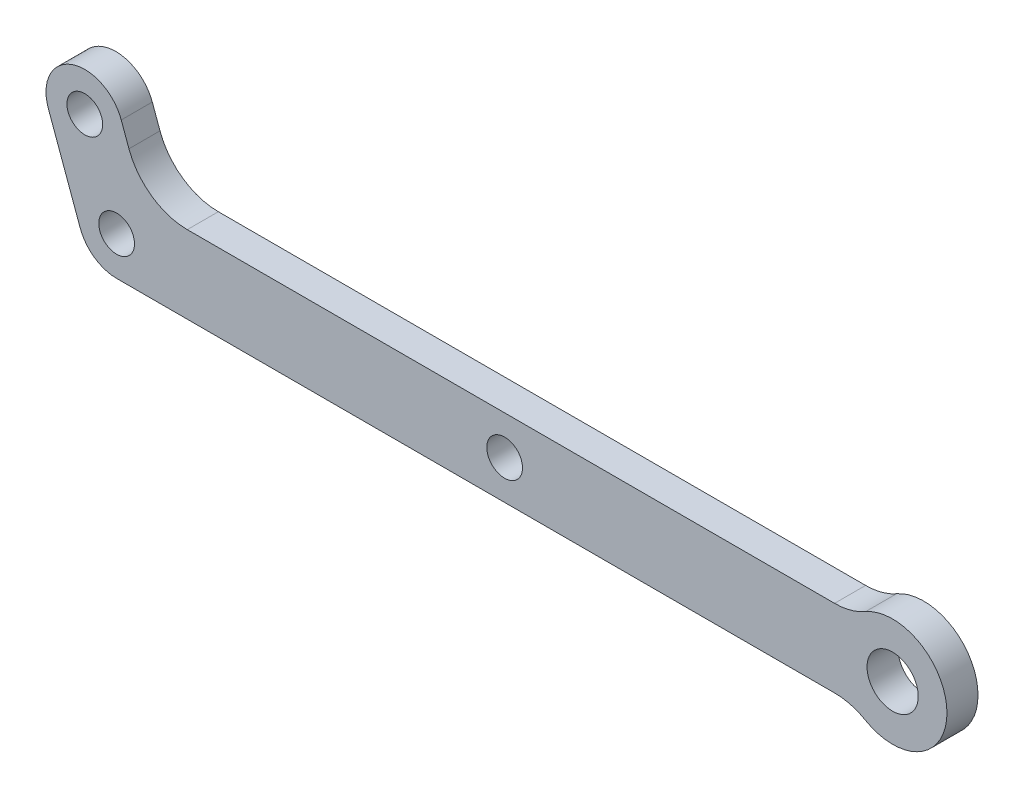
ISO-10303-21;
HEADER;
FILE_DESCRIPTION(('STEP AP214'),'2;1');
FILE_NAME('part.step','',(''),(''),'','','');
FILE_SCHEMA(('AUTOMOTIVE_DESIGN { 1 0 10303 214 1 1 1 1 }'));
ENDSEC;
DATA;
#1=APPLICATION_CONTEXT('core data for automotive mechanical design processes');
#2=APPLICATION_PROTOCOL_DEFINITION('international standard','automotive_design',2000,#1);
#3=PRODUCT_CONTEXT('',#1,'mechanical');
#4=PRODUCT('Part','Part','',(#3));
#5=PRODUCT_RELATED_PRODUCT_CATEGORY('part','',(#4));
#6=PRODUCT_DEFINITION_FORMATION('','',#4);
#7=PRODUCT_DEFINITION_CONTEXT('part definition',#1,'design');
#8=PRODUCT_DEFINITION('design','',#6,#7);
#9=PRODUCT_DEFINITION_SHAPE('','',#8);
#10=(LENGTH_UNIT() NAMED_UNIT(*) SI_UNIT(.MILLI.,.METRE.));
#11=(NAMED_UNIT(*) PLANE_ANGLE_UNIT() SI_UNIT($,.RADIAN.));
#12=(NAMED_UNIT(*) SI_UNIT($,.STERADIAN.) SOLID_ANGLE_UNIT());
#13=UNCERTAINTY_MEASURE_WITH_UNIT(LENGTH_MEASURE(1.E-05),#10,'distance_accuracy_value','');
#14=(GEOMETRIC_REPRESENTATION_CONTEXT(3) GLOBAL_UNCERTAINTY_ASSIGNED_CONTEXT((#13)) GLOBAL_UNIT_ASSIGNED_CONTEXT((#10,
#11,#12)) REPRESENTATION_CONTEXT('',''));
#15=CARTESIAN_POINT('',(0.,0.,0.));
#16=DIRECTION('',(0.,0.,1.));
#17=DIRECTION('',(1.,0.,0.));
#18=AXIS2_PLACEMENT_3D('',#15,#16,#17);
#19=CARTESIAN_POINT('',(-45.4486510016369,6.5,2.));
#20=DIRECTION('',(0.,0.,1.));
#21=DIRECTION('',(1.,0.,0.));
#22=AXIS2_PLACEMENT_3D('',#19,#20,#21);
#23=CYLINDRICAL_SURFACE('',#22,4.);
#24=CARTESIAN_POINT('',(-45.4486510016369,6.5,2.));
#25=DIRECTION('',(0.,0.,-1.));
#26=DIRECTION('',(1.,0.,0.));
#27=AXIS2_PLACEMENT_3D('',#24,#25,#26);
#28=CIRCLE('',#27,4.);
#29=CARTESIAN_POINT('',(-45.4486510016369,2.5,2.));
#30=VERTEX_POINT('',#29);
#31=CARTESIAN_POINT('',(-49.2074214847805,5.13191942669733,2.));
#32=VERTEX_POINT('',#31);
#33=EDGE_CURVE('E187',#30,#32,#28,.T.);
#34=ORIENTED_EDGE('',*,*,#33,.F.);
#35=DIRECTION('',(0.,0.,1.));
#36=VECTOR('',#35,1.);
#37=CARTESIAN_POINT('',(-45.4486510016369,2.5,2.));
#38=LINE('',#37,#36);
#39=CARTESIAN_POINT('',(-45.4486510016369,2.5,0.));
#40=VERTEX_POINT('',#39);
#41=EDGE_CURVE('E195',#40,#30,#38,.T.);
#42=ORIENTED_EDGE('',*,*,#41,.F.);
#43=CARTESIAN_POINT('',(-45.4486510016369,6.5,0.));
#44=DIRECTION('',(0.,0.,1.));
#45=DIRECTION('',(1.,0.,0.));
#46=AXIS2_PLACEMENT_3D('',#43,#44,#45);
#47=CIRCLE('',#46,4.);
#48=CARTESIAN_POINT('',(-49.2074214847805,5.13191942669733,0.));
#49=VERTEX_POINT('',#48);
#50=EDGE_CURVE('E27',#49,#40,#47,.T.);
#51=ORIENTED_EDGE('',*,*,#50,.F.);
#52=DIRECTION('',(0.,0.,-1.));
#53=VECTOR('',#52,1.);
#54=CARTESIAN_POINT('',(-49.2074214847805,5.13191942669733,0.));
#55=LINE('',#54,#53);
#56=EDGE_CURVE('E193',#32,#49,#55,.T.);
#57=ORIENTED_EDGE('',*,*,#56,.F.);
#58=EDGE_LOOP('',(#34,#42,#51,#57));
#59=FACE_BOUND('',#58,.T.);
#60=ADVANCED_FACE('F17',(#59),#23,.F.);
#61=CARTESIAN_POINT('',(-3.74165738677394,6.5,2.));
#62=DIRECTION('',(0.,0.,-1.));
#63=DIRECTION('',(-1.,0.,0.));
#64=AXIS2_PLACEMENT_3D('',#61,#62,#63);
#65=CYLINDRICAL_SURFACE('',#64,4.);
#66=CARTESIAN_POINT('',(-3.74165738677394,6.5,2.));
#67=DIRECTION('',(0.,0.,-1.));
#68=DIRECTION('',(1.,0.,0.));
#69=AXIS2_PLACEMENT_3D('',#66,#67,#68);
#70=CIRCLE('',#69,4.);
#71=CARTESIAN_POINT('',(-1.7461067804945,3.03333333333333,2.));
#72=VERTEX_POINT('',#71);
#73=CARTESIAN_POINT('',(-3.74165738677394,2.5,2.));
#74=VERTEX_POINT('',#73);
#75=EDGE_CURVE('E218',#72,#74,#70,.T.);
#76=ORIENTED_EDGE('',*,*,#75,.F.);
#77=DIRECTION('',(0.,0.,1.));
#78=VECTOR('',#77,1.);
#79=CARTESIAN_POINT('',(-1.7461067804945,3.03333333333333,2.));
#80=LINE('',#79,#78);
#81=CARTESIAN_POINT('',(-1.7461067804945,3.03333333333333,0.));
#82=VERTEX_POINT('',#81);
#83=EDGE_CURVE('E172',#82,#72,#80,.T.);
#84=ORIENTED_EDGE('',*,*,#83,.F.);
#85=CARTESIAN_POINT('',(-3.74165738677394,6.5,0.));
#86=DIRECTION('',(0.,0.,1.));
#87=DIRECTION('',(1.,0.,0.));
#88=AXIS2_PLACEMENT_3D('',#85,#86,#87);
#89=CIRCLE('',#88,4.);
#90=CARTESIAN_POINT('',(-3.74165738677394,2.5,0.));
#91=VERTEX_POINT('',#90);
#92=EDGE_CURVE('E11',#91,#82,#89,.T.);
#93=ORIENTED_EDGE('',*,*,#92,.F.);
#94=DIRECTION('',(0.,0.,-1.));
#95=VECTOR('',#94,1.);
#96=CARTESIAN_POINT('',(-3.74165738677394,2.5,0.));
#97=LINE('',#96,#95);
#98=EDGE_CURVE('E178',#74,#91,#97,.T.);
#99=ORIENTED_EDGE('',*,*,#98,.F.);
#100=EDGE_LOOP('',(#76,#84,#93,#99));
#101=FACE_BOUND('',#100,.T.);
#102=ADVANCED_FACE('F248',(#101),#65,.F.);
#103=CARTESIAN_POINT('',(-3.74165738677394,-6.5,2.));
#104=DIRECTION('',(0.,0.,-1.));
#105=DIRECTION('',(-1.,0.,0.));
#106=AXIS2_PLACEMENT_3D('',#103,#104,#105);
#107=CYLINDRICAL_SURFACE('',#106,4.);
#108=CARTESIAN_POINT('',(-3.74165738677394,-6.5,2.));
#109=DIRECTION('',(0.,0.,-1.));
#110=DIRECTION('',(1.,0.,0.));
#111=AXIS2_PLACEMENT_3D('',#108,#109,#110);
#112=CIRCLE('',#111,4.);
#113=CARTESIAN_POINT('',(-3.74165738677394,-2.5,2.));
#114=VERTEX_POINT('',#113);
#115=CARTESIAN_POINT('',(-1.7461067804945,-3.03333333333333,2.));
#116=VERTEX_POINT('',#115);
#117=EDGE_CURVE('E36',#114,#116,#112,.T.);
#118=ORIENTED_EDGE('',*,*,#117,.F.);
#119=DIRECTION('',(0.,0.,1.));
#120=VECTOR('',#119,1.);
#121=CARTESIAN_POINT('',(-3.74165738677394,-2.5,2.));
#122=LINE('',#121,#120);
#123=CARTESIAN_POINT('',(-3.74165738677394,-2.5,0.));
#124=VERTEX_POINT('',#123);
#125=EDGE_CURVE('E217',#124,#114,#122,.T.);
#126=ORIENTED_EDGE('',*,*,#125,.F.);
#127=CARTESIAN_POINT('',(-3.74165738677394,-6.5,0.));
#128=DIRECTION('',(0.,0.,1.));
#129=DIRECTION('',(1.,0.,0.));
#130=AXIS2_PLACEMENT_3D('',#127,#128,#129);
#131=CIRCLE('',#130,4.);
#132=CARTESIAN_POINT('',(-1.7461067804945,-3.03333333333333,0.));
#133=VERTEX_POINT('',#132);
#134=EDGE_CURVE('E184',#133,#124,#131,.T.);
#135=ORIENTED_EDGE('',*,*,#134,.F.);
#136=DIRECTION('',(0.,0.,-1.));
#137=VECTOR('',#136,1.);
#138=CARTESIAN_POINT('',(-1.7461067804945,-3.03333333333333,2.));
#139=LINE('',#138,#137);
#140=EDGE_CURVE('E161',#116,#133,#139,.T.);
#141=ORIENTED_EDGE('',*,*,#140,.F.);
#142=EDGE_LOOP('',(#118,#126,#135,#141));
#143=FACE_BOUND('',#142,.T.);
#144=ADVANCED_FACE('F254',(#143),#107,.F.);
#145=CARTESIAN_POINT('',(0.,0.,0.));
#146=DIRECTION('',(0.,0.,1.));
#147=DIRECTION('',(1.,0.,0.));
#148=AXIS2_PLACEMENT_3D('',#145,#146,#147);
#149=PLANE('',#148);
#150=CARTESIAN_POINT('',(-52.052120859954,5.63815572471545,0.));
#151=DIRECTION('',(0.,0.,1.));
#152=DIRECTION('',(1.,0.,0.));
#153=AXIS2_PLACEMENT_3D('',#150,#151,#152);
#154=CIRCLE('',#153,1.15);
#155=CARTESIAN_POINT('',(-50.902120859954,5.63815572471545,0.));
#156=VERTEX_POINT('',#155);
#157=EDGE_CURVE('E273',#156,#156,#154,.T.);
#158=ORIENTED_EDGE('',*,*,#157,.T.);
#159=EDGE_LOOP('',(#158));
#160=FACE_BOUND('',#159,.T.);
#161=CARTESIAN_POINT('',(0.,0.,0.));
#162=DIRECTION('',(0.,0.,1.));
#163=DIRECTION('',(1.,0.,0.));
#164=AXIS2_PLACEMENT_3D('',#161,#162,#163);
#165=CIRCLE('',#164,1.64999999999993);
#166=CARTESIAN_POINT('',(1.64999999999993,0.,0.));
#167=VERTEX_POINT('',#166);
#168=EDGE_CURVE('E144',#167,#167,#165,.T.);
#169=ORIENTED_EDGE('',*,*,#168,.T.);
#170=EDGE_LOOP('',(#169));
#171=FACE_BOUND('',#170,.T.);
#172=CARTESIAN_POINT('',(-50.,0.,0.));
#173=DIRECTION('',(0.,0.,1.));
#174=DIRECTION('',(1.,0.,0.));
#175=AXIS2_PLACEMENT_3D('',#172,#173,#174);
#176=CIRCLE('',#175,1.15);
#177=CARTESIAN_POINT('',(-48.85,0.,0.));
#178=VERTEX_POINT('',#177);
#179=EDGE_CURVE('E287',#178,#178,#176,.T.);
#180=ORIENTED_EDGE('',*,*,#179,.T.);
#181=EDGE_LOOP('',(#180));
#182=FACE_BOUND('',#181,.T.);
#183=CARTESIAN_POINT('',(-25.,0.,0.));
#184=DIRECTION('',(0.,0.,1.));
#185=DIRECTION('',(1.,0.,0.));
#186=AXIS2_PLACEMENT_3D('',#183,#184,#185);
#187=CIRCLE('',#186,1.15);
#188=CARTESIAN_POINT('',(-23.85,0.,0.));
#189=VERTEX_POINT('',#188);
#190=EDGE_CURVE('E271',#189,#189,#187,.T.);
#191=ORIENTED_EDGE('',*,*,#190,.T.);
#192=EDGE_LOOP('',(#191));
#193=FACE_BOUND('',#192,.T.);
#194=CARTESIAN_POINT('',(0.,0.,0.));
#195=DIRECTION('',(0.,0.,1.));
#196=DIRECTION('',(1.,0.,0.));
#197=AXIS2_PLACEMENT_3D('',#194,#195,#196);
#198=CIRCLE('',#197,3.5);
#199=EDGE_CURVE('E164',#133,#82,#198,.T.);
#200=ORIENTED_EDGE('',*,*,#199,.F.);
#201=ORIENTED_EDGE('',*,*,#134,.T.);
#202=DIRECTION('',(-1.,0.,0.));
#203=VECTOR('',#202,1.);
#204=CARTESIAN_POINT('',(0.,-2.5,0.));
#205=LINE('',#204,#203);
#206=CARTESIAN_POINT('',(-50.,-2.5,0.));
#207=VERTEX_POINT('',#206);
#208=EDGE_CURVE('E214',#124,#207,#205,.T.);
#209=ORIENTED_EDGE('',*,*,#208,.T.);
#210=CARTESIAN_POINT('',(-50.,0.,0.));
#211=DIRECTION('',(0.,0.,1.));
#212=DIRECTION('',(1.,0.,0.));
#213=AXIS2_PLACEMENT_3D('',#210,#211,#212);
#214=CIRCLE('',#213,2.5);
#215=CARTESIAN_POINT('',(-52.3492315519648,-0.855050358314174,0.));
#216=VERTEX_POINT('',#215);
#217=EDGE_CURVE('E127',#216,#207,#214,.T.);
#218=ORIENTED_EDGE('',*,*,#217,.F.);
#219=DIRECTION('',(-0.342020143325668,0.939692620785909,0.));
#220=VECTOR('',#219,1.);
#221=CARTESIAN_POINT('',(-46.5003426299392,-16.9247406004776,0.));
#222=LINE('',#221,#220);
#223=CARTESIAN_POINT('',(-54.4013524119188,4.78310536640128,0.));
#224=VERTEX_POINT('',#223);
#225=EDGE_CURVE('E169',#216,#224,#222,.T.);
#226=ORIENTED_EDGE('',*,*,#225,.T.);
#227=CARTESIAN_POINT('',(-52.052120859954,5.63815572471545,0.));
#228=DIRECTION('',(0.,0.,1.));
#229=DIRECTION('',(1.,0.,0.));
#230=AXIS2_PLACEMENT_3D('',#227,#228,#229);
#231=CIRCLE('',#230,2.5);
#232=CARTESIAN_POINT('',(-49.7028893079892,6.49320608302961,0.));
#233=VERTEX_POINT('',#232);
#234=EDGE_CURVE('E137',#233,#224,#231,.T.);
#235=ORIENTED_EDGE('',*,*,#234,.F.);
#236=DIRECTION('',(-0.342020143325666,0.93969262078591,0.));
#237=VECTOR('',#236,1.);
#238=CARTESIAN_POINT('',(-41.8018795260098,-15.2146398838492,0.));
#239=LINE('',#238,#237);
#240=EDGE_CURVE('E200',#49,#233,#239,.T.);
#241=ORIENTED_EDGE('',*,*,#240,.F.);
#242=ORIENTED_EDGE('',*,*,#50,.T.);
#243=DIRECTION('',(-1.,0.,0.));
#244=VECTOR('',#243,1.);
#245=CARTESIAN_POINT('',(0.,2.5,0.));
#246=LINE('',#245,#244);
#247=EDGE_CURVE('E182',#91,#40,#246,.T.);
#248=ORIENTED_EDGE('',*,*,#247,.F.);
#249=ORIENTED_EDGE('',*,*,#92,.T.);
#250=EDGE_LOOP('',(#200,#201,#209,#218,#226,#235,#241,#242,#248,#249));
#251=FACE_BOUND('',#250,.T.);
#252=ADVANCED_FACE('F238',(#160,#171,#182,#193,#251),#149,.F.);
#253=CARTESIAN_POINT('',(0.,0.,2.));
#254=DIRECTION('',(0.,0.,1.));
#255=DIRECTION('',(1.,0.,0.));
#256=AXIS2_PLACEMENT_3D('',#253,#254,#255);
#257=PLANE('',#256);
#258=CARTESIAN_POINT('',(-52.052120859954,5.63815572471545,2.));
#259=DIRECTION('',(0.,0.,1.));
#260=DIRECTION('',(1.,0.,0.));
#261=AXIS2_PLACEMENT_3D('',#258,#259,#260);
#262=CIRCLE('',#261,1.15);
#263=CARTESIAN_POINT('',(-50.902120859954,5.63815572471545,2.));
#264=VERTEX_POINT('',#263);
#265=EDGE_CURVE('E276',#264,#264,#262,.T.);
#266=ORIENTED_EDGE('',*,*,#265,.F.);
#267=EDGE_LOOP('',(#266));
#268=FACE_BOUND('',#267,.T.);
#269=CARTESIAN_POINT('',(0.,0.,2.));
#270=DIRECTION('',(0.,0.,1.));
#271=DIRECTION('',(1.,0.,0.));
#272=AXIS2_PLACEMENT_3D('',#269,#270,#271);
#273=CIRCLE('',#272,1.64999999999993);
#274=CARTESIAN_POINT('',(1.64999999999993,0.,2.));
#275=VERTEX_POINT('',#274);
#276=EDGE_CURVE('E153',#275,#275,#273,.T.);
#277=ORIENTED_EDGE('',*,*,#276,.F.);
#278=EDGE_LOOP('',(#277));
#279=FACE_BOUND('',#278,.T.);
#280=CARTESIAN_POINT('',(-50.,0.,2.));
#281=DIRECTION('',(0.,0.,1.));
#282=DIRECTION('',(1.,0.,0.));
#283=AXIS2_PLACEMENT_3D('',#280,#281,#282);
#284=CIRCLE('',#283,1.15);
#285=CARTESIAN_POINT('',(-48.85,0.,2.));
#286=VERTEX_POINT('',#285);
#287=EDGE_CURVE('E284',#286,#286,#284,.T.);
#288=ORIENTED_EDGE('',*,*,#287,.F.);
#289=EDGE_LOOP('',(#288));
#290=FACE_BOUND('',#289,.T.);
#291=CARTESIAN_POINT('',(-25.,0.,2.));
#292=DIRECTION('',(0.,0.,1.));
#293=DIRECTION('',(1.,0.,0.));
#294=AXIS2_PLACEMENT_3D('',#291,#292,#293);
#295=CIRCLE('',#294,1.15);
#296=CARTESIAN_POINT('',(-23.85,0.,2.));
#297=VERTEX_POINT('',#296);
#298=EDGE_CURVE('E279',#297,#297,#295,.T.);
#299=ORIENTED_EDGE('',*,*,#298,.F.);
#300=EDGE_LOOP('',(#299));
#301=FACE_BOUND('',#300,.T.);
#302=DIRECTION('',(-1.,0.,0.));
#303=VECTOR('',#302,1.);
#304=CARTESIAN_POINT('',(0.,-2.5,2.));
#305=LINE('',#304,#303);
#306=CARTESIAN_POINT('',(-50.,-2.5,2.));
#307=VERTEX_POINT('',#306);
#308=EDGE_CURVE('E223',#114,#307,#305,.T.);
#309=ORIENTED_EDGE('',*,*,#308,.F.);
#310=ORIENTED_EDGE('',*,*,#117,.T.);
#311=CARTESIAN_POINT('',(0.,0.,2.));
#312=DIRECTION('',(0.,0.,1.));
#313=DIRECTION('',(1.,0.,0.));
#314=AXIS2_PLACEMENT_3D('',#311,#312,#313);
#315=CIRCLE('',#314,3.5);
#316=EDGE_CURVE('E139',#116,#72,#315,.T.);
#317=ORIENTED_EDGE('',*,*,#316,.T.);
#318=ORIENTED_EDGE('',*,*,#75,.T.);
#319=DIRECTION('',(-1.,0.,0.));
#320=VECTOR('',#319,1.);
#321=CARTESIAN_POINT('',(0.,2.5,2.));
#322=LINE('',#321,#320);
#323=EDGE_CURVE('E177',#74,#30,#322,.T.);
#324=ORIENTED_EDGE('',*,*,#323,.T.);
#325=ORIENTED_EDGE('',*,*,#33,.T.);
#326=DIRECTION('',(-0.342020143325666,0.93969262078591,0.));
#327=VECTOR('',#326,1.);
#328=CARTESIAN_POINT('',(-41.8018795260098,-15.2146398838492,2.));
#329=LINE('',#328,#327);
#330=CARTESIAN_POINT('',(-49.7028893079892,6.49320608302961,2.));
#331=VERTEX_POINT('',#330);
#332=EDGE_CURVE('E141',#32,#331,#329,.T.);
#333=ORIENTED_EDGE('',*,*,#332,.T.);
#334=CARTESIAN_POINT('',(-52.052120859954,5.63815572471545,2.));
#335=DIRECTION('',(0.,0.,1.));
#336=DIRECTION('',(1.,0.,0.));
#337=AXIS2_PLACEMENT_3D('',#334,#335,#336);
#338=CIRCLE('',#337,2.5);
#339=CARTESIAN_POINT('',(-54.4013524119188,4.78310536640128,2.));
#340=VERTEX_POINT('',#339);
#341=EDGE_CURVE('E133',#331,#340,#338,.T.);
#342=ORIENTED_EDGE('',*,*,#341,.T.);
#343=DIRECTION('',(-0.342020143325668,0.939692620785909,0.));
#344=VECTOR('',#343,1.);
#345=CARTESIAN_POINT('',(-46.5003426299392,-16.9247406004776,2.));
#346=LINE('',#345,#344);
#347=CARTESIAN_POINT('',(-52.3492315519648,-0.855050358314174,2.));
#348=VERTEX_POINT('',#347);
#349=EDGE_CURVE('E117',#348,#340,#346,.T.);
#350=ORIENTED_EDGE('',*,*,#349,.F.);
#351=CARTESIAN_POINT('',(-50.,0.,2.));
#352=DIRECTION('',(0.,0.,1.));
#353=DIRECTION('',(1.,0.,0.));
#354=AXIS2_PLACEMENT_3D('',#351,#352,#353);
#355=CIRCLE('',#354,2.5);
#356=EDGE_CURVE('E215',#348,#307,#355,.T.);
#357=ORIENTED_EDGE('',*,*,#356,.T.);
#358=EDGE_LOOP('',(#309,#310,#317,#318,#324,#325,#333,#342,#350,#357));
#359=FACE_BOUND('',#358,.T.);
#360=ADVANCED_FACE('F143',(#268,#279,#290,#301,#359),#257,.T.);
#361=CARTESIAN_POINT('',(0.,-2.5,2.));
#362=DIRECTION('',(0.,-1.,0.));
#363=DIRECTION('',(0.,0.,-1.));
#364=AXIS2_PLACEMENT_3D('',#361,#362,#363);
#365=PLANE('',#364);
#366=ORIENTED_EDGE('',*,*,#208,.F.);
#367=ORIENTED_EDGE('',*,*,#125,.T.);
#368=ORIENTED_EDGE('',*,*,#308,.T.);
#369=DIRECTION('',(0.,0.,-1.));
#370=VECTOR('',#369,1.);
#371=CARTESIAN_POINT('',(-50.,-2.5,2.));
#372=LINE('',#371,#370);
#373=EDGE_CURVE('E206',#307,#207,#372,.T.);
#374=ORIENTED_EDGE('',*,*,#373,.T.);
#375=EDGE_LOOP('',(#366,#367,#368,#374));
#376=FACE_BOUND('',#375,.T.);
#377=ADVANCED_FACE('F256',(#376),#365,.T.);
#378=CARTESIAN_POINT('',(-50.,0.,2.));
#379=DIRECTION('',(0.,0.,-1.));
#380=DIRECTION('',(-1.,0.,0.));
#381=AXIS2_PLACEMENT_3D('',#378,#379,#380);
#382=CYLINDRICAL_SURFACE('',#381,2.5);
#383=ORIENTED_EDGE('',*,*,#217,.T.);
#384=ORIENTED_EDGE('',*,*,#373,.F.);
#385=ORIENTED_EDGE('',*,*,#356,.F.);
#386=DIRECTION('',(0.,0.,-1.));
#387=VECTOR('',#386,1.);
#388=CARTESIAN_POINT('',(-52.3492315519648,-0.855050358314174,2.));
#389=LINE('',#388,#387);
#390=EDGE_CURVE('E121',#348,#216,#389,.T.);
#391=ORIENTED_EDGE('',*,*,#390,.T.);
#392=EDGE_LOOP('',(#383,#384,#385,#391));
#393=FACE_BOUND('',#392,.T.);
#394=ADVANCED_FACE('F261',(#393),#382,.T.);
#395=CARTESIAN_POINT('',(-46.5003426299392,-16.9247406004776,2.));
#396=DIRECTION('',(-0.939692620785909,-0.342020143325668,0.));
#397=DIRECTION('',(-0.342020143325668,0.939692620785909,0.));
#398=AXIS2_PLACEMENT_3D('',#395,#396,#397);
#399=PLANE('',#398);
#400=ORIENTED_EDGE('',*,*,#225,.F.);
#401=ORIENTED_EDGE('',*,*,#390,.F.);
#402=ORIENTED_EDGE('',*,*,#349,.T.);
#403=DIRECTION('',(0.,0.,-1.));
#404=VECTOR('',#403,1.);
#405=CARTESIAN_POINT('',(-54.4013524119188,4.78310536640128,2.));
#406=LINE('',#405,#404);
#407=EDGE_CURVE('E122',#340,#224,#406,.T.);
#408=ORIENTED_EDGE('',*,*,#407,.T.);
#409=EDGE_LOOP('',(#400,#401,#402,#408));
#410=FACE_BOUND('',#409,.T.);
#411=ADVANCED_FACE('F120',(#410),#399,.T.);
#412=CARTESIAN_POINT('',(-41.8018795260098,-15.2146398838492,2.));
#413=DIRECTION('',(-0.93969262078591,-0.342020143325666,0.));
#414=DIRECTION('',(-0.342020143325666,0.93969262078591,0.));
#415=AXIS2_PLACEMENT_3D('',#412,#413,#414);
#416=PLANE('',#415);
#417=ORIENTED_EDGE('',*,*,#332,.F.);
#418=ORIENTED_EDGE('',*,*,#56,.T.);
#419=ORIENTED_EDGE('',*,*,#240,.T.);
#420=DIRECTION('',(0.,0.,-1.));
#421=VECTOR('',#420,1.);
#422=CARTESIAN_POINT('',(-49.7028893079892,6.49320608302961,2.));
#423=LINE('',#422,#421);
#424=EDGE_CURVE('E199',#331,#233,#423,.T.);
#425=ORIENTED_EDGE('',*,*,#424,.F.);
#426=EDGE_LOOP('',(#417,#418,#419,#425));
#427=FACE_BOUND('',#426,.T.);
#428=ADVANCED_FACE('F264',(#427),#416,.F.);
#429=CARTESIAN_POINT('',(0.,2.5,2.));
#430=DIRECTION('',(0.,-1.,0.));
#431=DIRECTION('',(0.,0.,-1.));
#432=AXIS2_PLACEMENT_3D('',#429,#430,#431);
#433=PLANE('',#432);
#434=ORIENTED_EDGE('',*,*,#323,.F.);
#435=ORIENTED_EDGE('',*,*,#98,.T.);
#436=ORIENTED_EDGE('',*,*,#247,.T.);
#437=ORIENTED_EDGE('',*,*,#41,.T.);
#438=EDGE_LOOP('',(#434,#435,#436,#437));
#439=FACE_BOUND('',#438,.T.);
#440=ADVANCED_FACE('F250',(#439),#433,.F.);
#441=CARTESIAN_POINT('',(0.,0.,2.));
#442=DIRECTION('',(0.,0.,-1.));
#443=DIRECTION('',(-1.,0.,0.));
#444=AXIS2_PLACEMENT_3D('',#441,#442,#443);
#445=CYLINDRICAL_SURFACE('',#444,3.5);
#446=ORIENTED_EDGE('',*,*,#316,.F.);
#447=ORIENTED_EDGE('',*,*,#140,.T.);
#448=ORIENTED_EDGE('',*,*,#199,.T.);
#449=ORIENTED_EDGE('',*,*,#83,.T.);
#450=EDGE_LOOP('',(#446,#447,#448,#449));
#451=FACE_BOUND('',#450,.T.);
#452=ADVANCED_FACE('F255',(#451),#445,.T.);
#453=CARTESIAN_POINT('',(-52.052120859954,5.63815572471545,2.));
#454=DIRECTION('',(0.,0.,-1.));
#455=DIRECTION('',(-1.,0.,0.));
#456=AXIS2_PLACEMENT_3D('',#453,#454,#455);
#457=CYLINDRICAL_SURFACE('',#456,2.5);
#458=ORIENTED_EDGE('',*,*,#341,.F.);
#459=ORIENTED_EDGE('',*,*,#424,.T.);
#460=ORIENTED_EDGE('',*,*,#234,.T.);
#461=ORIENTED_EDGE('',*,*,#407,.F.);
#462=EDGE_LOOP('',(#458,#459,#460,#461));
#463=FACE_BOUND('',#462,.T.);
#464=ADVANCED_FACE('F135',(#463),#457,.T.);
#465=CARTESIAN_POINT('',(0.,0.,2.));
#466=DIRECTION('',(0.,0.,-1.));
#467=DIRECTION('',(-1.,0.,0.));
#468=AXIS2_PLACEMENT_3D('',#465,#466,#467);
#469=CYLINDRICAL_SURFACE('',#468,1.64999999999993);
#470=ORIENTED_EDGE('',*,*,#168,.F.);
#471=EDGE_LOOP('',(#470));
#472=FACE_BOUND('',#471,.T.);
#473=ORIENTED_EDGE('',*,*,#276,.T.);
#474=EDGE_LOOP('',(#473));
#475=FACE_BOUND('',#474,.T.);
#476=ADVANCED_FACE('F298',(#472,#475),#469,.F.);
#477=CARTESIAN_POINT('',(-50.,0.,2.));
#478=DIRECTION('',(0.,0.,-1.));
#479=DIRECTION('',(-1.,0.,0.));
#480=AXIS2_PLACEMENT_3D('',#477,#478,#479);
#481=CYLINDRICAL_SURFACE('',#480,1.15);
#482=ORIENTED_EDGE('',*,*,#179,.F.);
#483=EDGE_LOOP('',(#482));
#484=FACE_BOUND('',#483,.T.);
#485=ORIENTED_EDGE('',*,*,#287,.T.);
#486=EDGE_LOOP('',(#485));
#487=FACE_BOUND('',#486,.T.);
#488=ADVANCED_FACE('F315',(#484,#487),#481,.F.);
#489=CARTESIAN_POINT('',(-25.,0.,2.));
#490=DIRECTION('',(0.,0.,-1.));
#491=DIRECTION('',(-1.,0.,0.));
#492=AXIS2_PLACEMENT_3D('',#489,#490,#491);
#493=CYLINDRICAL_SURFACE('',#492,1.15);
#494=ORIENTED_EDGE('',*,*,#190,.F.);
#495=EDGE_LOOP('',(#494));
#496=FACE_BOUND('',#495,.T.);
#497=ORIENTED_EDGE('',*,*,#298,.T.);
#498=EDGE_LOOP('',(#497));
#499=FACE_BOUND('',#498,.T.);
#500=ADVANCED_FACE('F310',(#496,#499),#493,.F.);
#501=CARTESIAN_POINT('',(-52.052120859954,5.63815572471545,2.));
#502=DIRECTION('',(0.,0.,-1.));
#503=DIRECTION('',(-1.,0.,0.));
#504=AXIS2_PLACEMENT_3D('',#501,#502,#503);
#505=CYLINDRICAL_SURFACE('',#504,1.15);
#506=ORIENTED_EDGE('',*,*,#157,.F.);
#507=EDGE_LOOP('',(#506));
#508=FACE_BOUND('',#507,.T.);
#509=ORIENTED_EDGE('',*,*,#265,.T.);
#510=EDGE_LOOP('',(#509));
#511=FACE_BOUND('',#510,.T.);
#512=ADVANCED_FACE('F313',(#508,#511),#505,.F.);
#513=CLOSED_SHELL('',(#60,#102,#144,#252,#360,#377,#394,#411,#428,#440,#452,#464,#476,#488,#500,#512));
#514=MANIFOLD_SOLID_BREP('B1',#513);
#515=ADVANCED_BREP_SHAPE_REPRESENTATION('',(#18,#514),#14);
#516=SHAPE_DEFINITION_REPRESENTATION(#9,#515);
ENDSEC;
END-ISO-10303-21;
